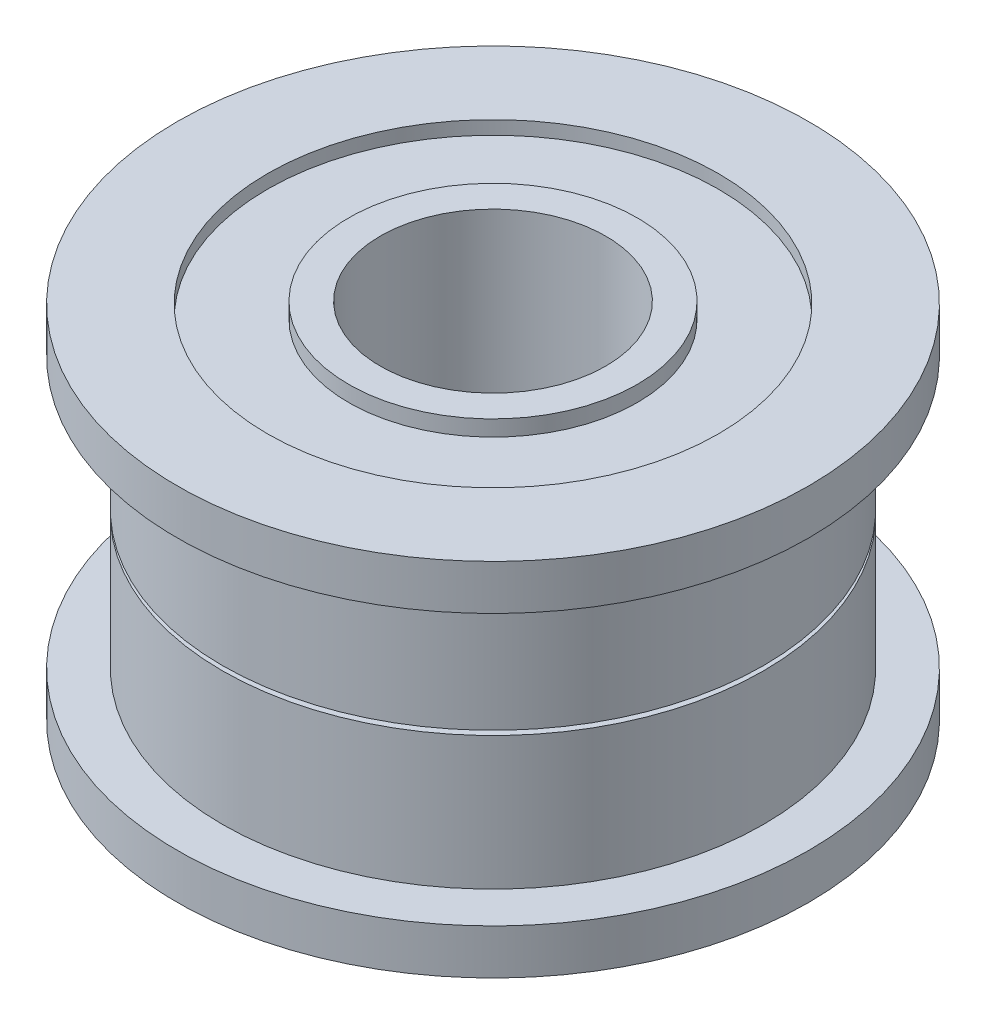
ISO-10303-21;
HEADER;
FILE_DESCRIPTION(('STEP AP214'),'2;1');
FILE_NAME('part.step','',(''),(''),'','','');
FILE_SCHEMA(('AUTOMOTIVE_DESIGN { 1 0 10303 214 1 1 1 1 }'));
ENDSEC;
DATA;
#1=APPLICATION_CONTEXT('core data for automotive mechanical design processes');
#2=APPLICATION_PROTOCOL_DEFINITION('international standard','automotive_design',2000,#1);
#3=PRODUCT_CONTEXT('',#1,'mechanical');
#4=PRODUCT('Part','Part','',(#3));
#5=PRODUCT_RELATED_PRODUCT_CATEGORY('part','',(#4));
#6=PRODUCT_DEFINITION_FORMATION('','',#4);
#7=PRODUCT_DEFINITION_CONTEXT('part definition',#1,'design');
#8=PRODUCT_DEFINITION('design','',#6,#7);
#9=PRODUCT_DEFINITION_SHAPE('','',#8);
#10=(LENGTH_UNIT() NAMED_UNIT(*) SI_UNIT(.MILLI.,.METRE.));
#11=(NAMED_UNIT(*) PLANE_ANGLE_UNIT() SI_UNIT($,.RADIAN.));
#12=(NAMED_UNIT(*) SI_UNIT($,.STERADIAN.) SOLID_ANGLE_UNIT());
#13=UNCERTAINTY_MEASURE_WITH_UNIT(LENGTH_MEASURE(1.E-05),#10,'distance_accuracy_value','');
#14=(GEOMETRIC_REPRESENTATION_CONTEXT(3) GLOBAL_UNCERTAINTY_ASSIGNED_CONTEXT((#13)) GLOBAL_UNIT_ASSIGNED_CONTEXT((#10,
#11,#12)) REPRESENTATION_CONTEXT('',''));
#15=CARTESIAN_POINT('',(0.,0.,0.));
#16=DIRECTION('',(0.,0.,1.));
#17=DIRECTION('',(1.,0.,0.));
#18=AXIS2_PLACEMENT_3D('',#15,#16,#17);
#19=CARTESIAN_POINT('',(0.,3.94999999999998,0.));
#20=DIRECTION('',(0.,1.,0.));
#21=DIRECTION('',(-1.,0.,0.));
#22=AXIS2_PLACEMENT_3D('',#19,#20,#21);
#23=PLANE('',#22);
#24=CARTESIAN_POINT('',(0.,3.9499999999999,0.));
#25=DIRECTION('',(0.,-1.,0.));
#26=DIRECTION('',(1.,0.,0.));
#27=AXIS2_PLACEMENT_3D('',#24,#25,#26);
#28=CIRCLE('',#27,5.00000000000001);
#29=CARTESIAN_POINT('',(5.,3.94999999999992,0.));
#30=VERTEX_POINT('',#29);
#31=EDGE_CURVE('E10',#30,#30,#28,.T.);
#32=ORIENTED_EDGE('',*,*,#31,.T.);
#33=EDGE_LOOP('',(#32));
#34=FACE_BOUND('',#33,.T.);
#35=CARTESIAN_POINT('',(0.,3.9499999999999,0.));
#36=DIRECTION('',(0.,-1.,0.));
#37=DIRECTION('',(1.,0.,0.));
#38=AXIS2_PLACEMENT_3D('',#35,#36,#37);
#39=CIRCLE('',#38,6.00000000000001);
#40=CARTESIAN_POINT('',(6.,3.94999999999992,0.));
#41=VERTEX_POINT('',#40);
#42=EDGE_CURVE('E74',#41,#41,#39,.T.);
#43=ORIENTED_EDGE('',*,*,#42,.F.);
#44=EDGE_LOOP('',(#43));
#45=FACE_BOUND('',#44,.T.);
#46=ADVANCED_FACE('F34',(#34,#45),#23,.T.);
#47=CARTESIAN_POINT('',(3.49148133884313E-12,-1000.,0.));
#48=DIRECTION('',(0.,-1.,0.));
#49=DIRECTION('',(1.,0.,0.));
#50=AXIS2_PLACEMENT_3D('',#47,#48,#49);
#51=CYLINDRICAL_SURFACE('',#50,5.00000000000001);
#52=CARTESIAN_POINT('',(0.,3.70000000000004,0.));
#53=DIRECTION('',(0.,-1.,0.));
#54=DIRECTION('',(1.,0.,0.));
#55=AXIS2_PLACEMENT_3D('',#52,#53,#54);
#56=CIRCLE('',#55,5.00000000000001);
#57=CARTESIAN_POINT('',(5.,3.70000000000005,0.));
#58=VERTEX_POINT('',#57);
#59=EDGE_CURVE('E40',#58,#58,#56,.T.);
#60=ORIENTED_EDGE('',*,*,#59,.T.);
#61=EDGE_LOOP('',(#60));
#62=FACE_BOUND('',#61,.T.);
#63=ORIENTED_EDGE('',*,*,#31,.F.);
#64=EDGE_LOOP('',(#63));
#65=FACE_BOUND('',#64,.T.);
#66=ADVANCED_FACE('F182',(#62,#65),#51,.F.);
#67=CARTESIAN_POINT('',(0.,3.69999999999999,0.));
#68=DIRECTION('',(0.,-1.,0.));
#69=DIRECTION('',(1.,0.,0.));
#70=AXIS2_PLACEMENT_3D('',#67,#68,#69);
#71=PLANE('',#70);
#72=ORIENTED_EDGE('',*,*,#59,.F.);
#73=EDGE_LOOP('',(#72));
#74=FACE_BOUND('',#73,.T.);
#75=CARTESIAN_POINT('',(0.,3.70000000000004,0.));
#76=DIRECTION('',(0.,-1.,0.));
#77=DIRECTION('',(1.,0.,0.));
#78=AXIS2_PLACEMENT_3D('',#75,#76,#77);
#79=CIRCLE('',#78,3.20000000000001);
#80=CARTESIAN_POINT('',(3.2,3.70000000000005,0.));
#81=VERTEX_POINT('',#80);
#82=EDGE_CURVE('E44',#81,#81,#79,.T.);
#83=ORIENTED_EDGE('',*,*,#82,.T.);
#84=EDGE_LOOP('',(#83));
#85=FACE_BOUND('',#84,.T.);
#86=ADVANCED_FACE('F178',(#74,#85),#71,.F.);
#87=CARTESIAN_POINT('',(3.49148133884313E-12,-1000.,0.));
#88=DIRECTION('',(0.,-1.,0.));
#89=DIRECTION('',(1.,0.,0.));
#90=AXIS2_PLACEMENT_3D('',#87,#88,#89);
#91=CYLINDRICAL_SURFACE('',#90,3.20000000000001);
#92=CARTESIAN_POINT('',(0.,4.29999999999993,0.));
#93=DIRECTION('',(0.,-1.,0.));
#94=DIRECTION('',(1.,0.,0.));
#95=AXIS2_PLACEMENT_3D('',#92,#93,#94);
#96=CIRCLE('',#95,3.20000000000001);
#97=CARTESIAN_POINT('',(3.2,4.29999999999994,0.));
#98=VERTEX_POINT('',#97);
#99=EDGE_CURVE('E83',#98,#98,#96,.T.);
#100=ORIENTED_EDGE('',*,*,#99,.T.);
#101=EDGE_LOOP('',(#100));
#102=FACE_BOUND('',#101,.T.);
#103=ORIENTED_EDGE('',*,*,#82,.F.);
#104=EDGE_LOOP('',(#103));
#105=FACE_BOUND('',#104,.T.);
#106=ADVANCED_FACE('F168',(#102,#105),#91,.T.);
#107=CARTESIAN_POINT('',(3.49148133884313E-12,-1000.,0.));
#108=DIRECTION('',(0.,-1.,0.));
#109=DIRECTION('',(1.,0.,0.));
#110=AXIS2_PLACEMENT_3D('',#107,#108,#109);
#111=CYLINDRICAL_SURFACE('',#110,2.50000000000001);
#112=CARTESIAN_POINT('',(0.,-0.0499999999999945,0.));
#113=DIRECTION('',(0.,-1.,0.));
#114=DIRECTION('',(1.,0.,0.));
#115=AXIS2_PLACEMENT_3D('',#112,#113,#114);
#116=CIRCLE('',#115,2.5);
#117=CARTESIAN_POINT('',(2.5,-0.0499999999999858,0.));
#118=VERTEX_POINT('',#117);
#119=EDGE_CURVE('E48',#118,#118,#116,.T.);
#120=ORIENTED_EDGE('',*,*,#119,.T.);
#121=EDGE_LOOP('',(#120));
#122=FACE_BOUND('',#121,.T.);
#123=CARTESIAN_POINT('',(0.,8.04999999999996,0.));
#124=DIRECTION('',(0.,-1.,0.));
#125=DIRECTION('',(1.,0.,0.));
#126=AXIS2_PLACEMENT_3D('',#123,#124,#125);
#127=CIRCLE('',#126,2.5);
#128=CARTESIAN_POINT('',(2.49999999999997,8.04999999999997,0.));
#129=VERTEX_POINT('',#128);
#130=EDGE_CURVE('E86',#129,#129,#127,.T.);
#131=ORIENTED_EDGE('',*,*,#130,.F.);
#132=EDGE_LOOP('',(#131));
#133=FACE_BOUND('',#132,.T.);
#134=ADVANCED_FACE('F165',(#122,#133),#111,.F.);
#135=CARTESIAN_POINT('',(0.,-0.05000000000001,0.));
#136=DIRECTION('',(0.,-1.,0.));
#137=DIRECTION('',(1.,0.,0.));
#138=AXIS2_PLACEMENT_3D('',#135,#136,#137);
#139=PLANE('',#138);
#140=CARTESIAN_POINT('',(0.,-0.0499999999999945,0.));
#141=DIRECTION('',(0.,-1.,0.));
#142=DIRECTION('',(1.,0.,0.));
#143=AXIS2_PLACEMENT_3D('',#140,#141,#142);
#144=CIRCLE('',#143,3.2);
#145=CARTESIAN_POINT('',(3.2,-0.0499999999999833,0.));
#146=VERTEX_POINT('',#145);
#147=EDGE_CURVE('E53',#146,#146,#144,.T.);
#148=ORIENTED_EDGE('',*,*,#147,.T.);
#149=EDGE_LOOP('',(#148));
#150=FACE_BOUND('',#149,.T.);
#151=ORIENTED_EDGE('',*,*,#119,.F.);
#152=EDGE_LOOP('',(#151));
#153=FACE_BOUND('',#152,.T.);
#154=ADVANCED_FACE('F167',(#150,#153),#139,.T.);
#155=CARTESIAN_POINT('',(3.49148133884313E-12,-1000.,0.));
#156=DIRECTION('',(0.,-1.,0.));
#157=DIRECTION('',(1.,0.,0.));
#158=AXIS2_PLACEMENT_3D('',#155,#156,#157);
#159=CYLINDRICAL_SURFACE('',#158,3.2);
#160=CARTESIAN_POINT('',(0.,0.299999999999967,0.));
#161=DIRECTION('',(0.,-1.,0.));
#162=DIRECTION('',(1.,0.,0.));
#163=AXIS2_PLACEMENT_3D('',#160,#161,#162);
#164=CIRCLE('',#163,3.2);
#165=CARTESIAN_POINT('',(3.2,0.299999999999978,0.));
#166=VERTEX_POINT('',#165);
#167=EDGE_CURVE('E56',#166,#166,#164,.T.);
#168=ORIENTED_EDGE('',*,*,#167,.T.);
#169=EDGE_LOOP('',(#168));
#170=FACE_BOUND('',#169,.T.);
#171=ORIENTED_EDGE('',*,*,#147,.F.);
#172=EDGE_LOOP('',(#171));
#173=FACE_BOUND('',#172,.T.);
#174=ADVANCED_FACE('F175',(#170,#173),#159,.T.);
#175=CARTESIAN_POINT('',(0.,0.299999999999986,0.));
#176=DIRECTION('',(0.,-1.,0.));
#177=DIRECTION('',(1.,0.,0.));
#178=AXIS2_PLACEMENT_3D('',#175,#176,#177);
#179=PLANE('',#178);
#180=CARTESIAN_POINT('',(0.,0.299999999999967,0.));
#181=DIRECTION('',(0.,-1.,0.));
#182=DIRECTION('',(1.,0.,0.));
#183=AXIS2_PLACEMENT_3D('',#180,#181,#182);
#184=CIRCLE('',#183,5.);
#185=CARTESIAN_POINT('',(5.,0.299999999999984,0.));
#186=VERTEX_POINT('',#185);
#187=EDGE_CURVE('E59',#186,#186,#184,.T.);
#188=ORIENTED_EDGE('',*,*,#187,.T.);
#189=EDGE_LOOP('',(#188));
#190=FACE_BOUND('',#189,.T.);
#191=ORIENTED_EDGE('',*,*,#167,.F.);
#192=EDGE_LOOP('',(#191));
#193=FACE_BOUND('',#192,.T.);
#194=ADVANCED_FACE('F216',(#190,#193),#179,.T.);
#195=CARTESIAN_POINT('',(3.49148133884313E-12,-1000.,0.));
#196=DIRECTION('',(0.,-1.,0.));
#197=DIRECTION('',(1.,0.,0.));
#198=AXIS2_PLACEMENT_3D('',#195,#196,#197);
#199=CYLINDRICAL_SURFACE('',#198,5.);
#200=CARTESIAN_POINT('',(0.,0.,0.));
#201=DIRECTION('',(0.,-1.,0.));
#202=DIRECTION('',(1.,0.,0.));
#203=AXIS2_PLACEMENT_3D('',#200,#201,#202);
#204=CIRCLE('',#203,5.);
#205=CARTESIAN_POINT('',(5.,0.,0.));
#206=VERTEX_POINT('',#205);
#207=EDGE_CURVE('E62',#206,#206,#204,.T.);
#208=ORIENTED_EDGE('',*,*,#207,.T.);
#209=EDGE_LOOP('',(#208));
#210=FACE_BOUND('',#209,.T.);
#211=ORIENTED_EDGE('',*,*,#187,.F.);
#212=EDGE_LOOP('',(#211));
#213=FACE_BOUND('',#212,.T.);
#214=ADVANCED_FACE('F210',(#210,#213),#199,.F.);
#215=CARTESIAN_POINT('',(0.,0.,0.));
#216=DIRECTION('',(0.,-1.,0.));
#217=DIRECTION('',(1.,0.,0.));
#218=AXIS2_PLACEMENT_3D('',#215,#216,#217);
#219=PLANE('',#218);
#220=CARTESIAN_POINT('',(0.,0.,0.));
#221=DIRECTION('',(0.,-1.,0.));
#222=DIRECTION('',(1.,0.,0.));
#223=AXIS2_PLACEMENT_3D('',#220,#221,#222);
#224=CIRCLE('',#223,7.);
#225=CARTESIAN_POINT('',(7.,0.,0.));
#226=VERTEX_POINT('',#225);
#227=EDGE_CURVE('E65',#226,#226,#224,.T.);
#228=ORIENTED_EDGE('',*,*,#227,.T.);
#229=EDGE_LOOP('',(#228));
#230=FACE_BOUND('',#229,.T.);
#231=ORIENTED_EDGE('',*,*,#207,.F.);
#232=EDGE_LOOP('',(#231));
#233=FACE_BOUND('',#232,.T.);
#234=ADVANCED_FACE('F204',(#230,#233),#219,.T.);
#235=CARTESIAN_POINT('',(3.49148133884313E-12,-1000.,0.));
#236=DIRECTION('',(0.,-1.,0.));
#237=DIRECTION('',(1.,0.,0.));
#238=AXIS2_PLACEMENT_3D('',#235,#236,#237);
#239=CYLINDRICAL_SURFACE('',#238,7.);
#240=CARTESIAN_POINT('',(0.,0.99999999999989,0.));
#241=DIRECTION('',(0.,-1.,0.));
#242=DIRECTION('',(1.,0.,0.));
#243=AXIS2_PLACEMENT_3D('',#240,#241,#242);
#244=CIRCLE('',#243,7.);
#245=CARTESIAN_POINT('',(7.,0.999999999999914,0.));
#246=VERTEX_POINT('',#245);
#247=EDGE_CURVE('E68',#246,#246,#244,.T.);
#248=ORIENTED_EDGE('',*,*,#247,.T.);
#249=EDGE_LOOP('',(#248));
#250=FACE_BOUND('',#249,.T.);
#251=ORIENTED_EDGE('',*,*,#227,.F.);
#252=EDGE_LOOP('',(#251));
#253=FACE_BOUND('',#252,.T.);
#254=ADVANCED_FACE('F198',(#250,#253),#239,.T.);
#255=CARTESIAN_POINT('',(0.,0.999999999999977,0.));
#256=DIRECTION('',(0.,1.,0.));
#257=DIRECTION('',(-1.,0.,0.));
#258=AXIS2_PLACEMENT_3D('',#255,#256,#257);
#259=PLANE('',#258);
#260=CARTESIAN_POINT('',(0.,0.99999999999989,0.));
#261=DIRECTION('',(0.,-1.,0.));
#262=DIRECTION('',(1.,0.,0.));
#263=AXIS2_PLACEMENT_3D('',#260,#261,#262);
#264=CIRCLE('',#263,6.);
#265=CARTESIAN_POINT('',(6.,0.999999999999911,0.));
#266=VERTEX_POINT('',#265);
#267=EDGE_CURVE('E71',#266,#266,#264,.T.);
#268=ORIENTED_EDGE('',*,*,#267,.T.);
#269=EDGE_LOOP('',(#268));
#270=FACE_BOUND('',#269,.T.);
#271=ORIENTED_EDGE('',*,*,#247,.F.);
#272=EDGE_LOOP('',(#271));
#273=FACE_BOUND('',#272,.T.);
#274=ADVANCED_FACE('F192',(#270,#273),#259,.T.);
#275=CARTESIAN_POINT('',(3.49148133884313E-12,-1000.,0.));
#276=DIRECTION('',(0.,-1.,0.));
#277=DIRECTION('',(1.,0.,0.));
#278=AXIS2_PLACEMENT_3D('',#275,#276,#277);
#279=CYLINDRICAL_SURFACE('',#278,6.00000000000001);
#280=ORIENTED_EDGE('',*,*,#42,.T.);
#281=EDGE_LOOP('',(#280));
#282=FACE_BOUND('',#281,.T.);
#283=ORIENTED_EDGE('',*,*,#267,.F.);
#284=EDGE_LOOP('',(#283));
#285=FACE_BOUND('',#284,.T.);
#286=ADVANCED_FACE('F189',(#282,#285),#279,.T.);
#287=CARTESIAN_POINT('',(0.,4.04999999999998,0.));
#288=DIRECTION('',(0.,-1.,0.));
#289=DIRECTION('',(-1.,0.,0.));
#290=AXIS2_PLACEMENT_3D('',#287,#288,#289);
#291=PLANE('',#290);
#292=CARTESIAN_POINT('',(0.,4.05000000000006,0.));
#293=DIRECTION('',(0.,-1.,0.));
#294=DIRECTION('',(1.,0.,0.));
#295=AXIS2_PLACEMENT_3D('',#292,#293,#294);
#296=CIRCLE('',#295,5.00000000000001);
#297=CARTESIAN_POINT('',(5.,4.05000000000008,0.));
#298=VERTEX_POINT('',#297);
#299=EDGE_CURVE('E77',#298,#298,#296,.T.);
#300=ORIENTED_EDGE('',*,*,#299,.F.);
#301=EDGE_LOOP('',(#300));
#302=FACE_BOUND('',#301,.T.);
#303=CARTESIAN_POINT('',(0.,4.05000000000006,0.));
#304=DIRECTION('',(0.,-1.,0.));
#305=DIRECTION('',(1.,0.,0.));
#306=AXIS2_PLACEMENT_3D('',#303,#304,#305);
#307=CIRCLE('',#306,6.00000000000001);
#308=CARTESIAN_POINT('',(6.,4.05000000000009,0.));
#309=VERTEX_POINT('',#308);
#310=EDGE_CURVE('E110',#309,#309,#307,.T.);
#311=ORIENTED_EDGE('',*,*,#310,.T.);
#312=EDGE_LOOP('',(#311));
#313=FACE_BOUND('',#312,.T.);
#314=ADVANCED_FACE('F114',(#302,#313),#291,.T.);
#315=CARTESIAN_POINT('',(-3.51941318955388E-12,1008.,0.));
#316=DIRECTION('',(0.,1.,0.));
#317=DIRECTION('',(1.,0.,0.));
#318=AXIS2_PLACEMENT_3D('',#315,#316,#317);
#319=CYLINDRICAL_SURFACE('',#318,5.00000000000001);
#320=CARTESIAN_POINT('',(0.,4.29999999999993,0.));
#321=DIRECTION('',(0.,-1.,0.));
#322=DIRECTION('',(1.,0.,0.));
#323=AXIS2_PLACEMENT_3D('',#320,#321,#322);
#324=CIRCLE('',#323,5.00000000000001);
#325=CARTESIAN_POINT('',(5.,4.29999999999994,0.));
#326=VERTEX_POINT('',#325);
#327=EDGE_CURVE('E80',#326,#326,#324,.T.);
#328=ORIENTED_EDGE('',*,*,#327,.F.);
#329=EDGE_LOOP('',(#328));
#330=FACE_BOUND('',#329,.T.);
#331=ORIENTED_EDGE('',*,*,#299,.T.);
#332=EDGE_LOOP('',(#331));
#333=FACE_BOUND('',#332,.T.);
#334=ADVANCED_FACE('F236',(#330,#333),#319,.F.);
#335=CARTESIAN_POINT('',(0.,4.29999999999998,0.));
#336=DIRECTION('',(0.,1.,0.));
#337=DIRECTION('',(1.,0.,0.));
#338=AXIS2_PLACEMENT_3D('',#335,#336,#337);
#339=PLANE('',#338);
#340=ORIENTED_EDGE('',*,*,#327,.T.);
#341=EDGE_LOOP('',(#340));
#342=FACE_BOUND('',#341,.T.);
#343=ORIENTED_EDGE('',*,*,#99,.F.);
#344=EDGE_LOOP('',(#343));
#345=FACE_BOUND('',#344,.T.);
#346=ADVANCED_FACE('F161',(#342,#345),#339,.F.);
#347=CARTESIAN_POINT('',(0.,8.04999999999997,0.));
#348=DIRECTION('',(0.,1.,0.));
#349=DIRECTION('',(1.,0.,0.));
#350=AXIS2_PLACEMENT_3D('',#347,#348,#349);
#351=PLANE('',#350);
#352=CARTESIAN_POINT('',(0.,8.04999999999996,0.));
#353=DIRECTION('',(0.,-1.,0.));
#354=DIRECTION('',(1.,0.,0.));
#355=AXIS2_PLACEMENT_3D('',#352,#353,#354);
#356=CIRCLE('',#355,3.2);
#357=CARTESIAN_POINT('',(3.19999999999997,8.04999999999997,0.));
#358=VERTEX_POINT('',#357);
#359=EDGE_CURVE('E89',#358,#358,#356,.T.);
#360=ORIENTED_EDGE('',*,*,#359,.F.);
#361=EDGE_LOOP('',(#360));
#362=FACE_BOUND('',#361,.T.);
#363=ORIENTED_EDGE('',*,*,#130,.T.);
#364=EDGE_LOOP('',(#363));
#365=FACE_BOUND('',#364,.T.);
#366=ADVANCED_FACE('F155',(#362,#365),#351,.T.);
#367=CARTESIAN_POINT('',(-3.51941318955388E-12,1008.,0.));
#368=DIRECTION('',(0.,1.,0.));
#369=DIRECTION('',(1.,0.,0.));
#370=AXIS2_PLACEMENT_3D('',#367,#368,#369);
#371=CYLINDRICAL_SURFACE('',#370,3.2);
#372=CARTESIAN_POINT('',(0.,7.69999999999999,0.));
#373=DIRECTION('',(0.,-1.,0.));
#374=DIRECTION('',(1.,0.,0.));
#375=AXIS2_PLACEMENT_3D('',#372,#373,#374);
#376=CIRCLE('',#375,3.2);
#377=CARTESIAN_POINT('',(3.19999999999997,7.70000000000001,0.));
#378=VERTEX_POINT('',#377);
#379=EDGE_CURVE('E92',#378,#378,#376,.T.);
#380=ORIENTED_EDGE('',*,*,#379,.F.);
#381=EDGE_LOOP('',(#380));
#382=FACE_BOUND('',#381,.T.);
#383=ORIENTED_EDGE('',*,*,#359,.T.);
#384=EDGE_LOOP('',(#383));
#385=FACE_BOUND('',#384,.T.);
#386=ADVANCED_FACE('F149',(#382,#385),#371,.T.);
#387=CARTESIAN_POINT('',(0.,7.69999999999998,0.));
#388=DIRECTION('',(0.,1.,0.));
#389=DIRECTION('',(1.,0.,0.));
#390=AXIS2_PLACEMENT_3D('',#387,#388,#389);
#391=PLANE('',#390);
#392=CARTESIAN_POINT('',(0.,7.69999999999999,0.));
#393=DIRECTION('',(0.,-1.,0.));
#394=DIRECTION('',(1.,0.,0.));
#395=AXIS2_PLACEMENT_3D('',#392,#393,#394);
#396=CIRCLE('',#395,5.);
#397=CARTESIAN_POINT('',(4.99999999999998,7.70000000000001,0.));
#398=VERTEX_POINT('',#397);
#399=EDGE_CURVE('E95',#398,#398,#396,.T.);
#400=ORIENTED_EDGE('',*,*,#399,.F.);
#401=EDGE_LOOP('',(#400));
#402=FACE_BOUND('',#401,.T.);
#403=ORIENTED_EDGE('',*,*,#379,.T.);
#404=EDGE_LOOP('',(#403));
#405=FACE_BOUND('',#404,.T.);
#406=ADVANCED_FACE('F143',(#402,#405),#391,.T.);
#407=CARTESIAN_POINT('',(-3.51941318955388E-12,1008.,0.));
#408=DIRECTION('',(0.,1.,0.));
#409=DIRECTION('',(1.,0.,0.));
#410=AXIS2_PLACEMENT_3D('',#407,#408,#409);
#411=CYLINDRICAL_SURFACE('',#410,5.);
#412=CARTESIAN_POINT('',(0.,7.99999999999996,0.));
#413=DIRECTION('',(0.,-1.,0.));
#414=DIRECTION('',(1.,0.,0.));
#415=AXIS2_PLACEMENT_3D('',#412,#413,#414);
#416=CIRCLE('',#415,5.);
#417=CARTESIAN_POINT('',(4.99999999999997,7.99999999999998,0.));
#418=VERTEX_POINT('',#417);
#419=EDGE_CURVE('E98',#418,#418,#416,.T.);
#420=ORIENTED_EDGE('',*,*,#419,.F.);
#421=EDGE_LOOP('',(#420));
#422=FACE_BOUND('',#421,.T.);
#423=ORIENTED_EDGE('',*,*,#399,.T.);
#424=EDGE_LOOP('',(#423));
#425=FACE_BOUND('',#424,.T.);
#426=ADVANCED_FACE('F137',(#422,#425),#411,.F.);
#427=CARTESIAN_POINT('',(0.,7.99999999999998,0.));
#428=DIRECTION('',(0.,1.,0.));
#429=DIRECTION('',(1.,0.,0.));
#430=AXIS2_PLACEMENT_3D('',#427,#428,#429);
#431=PLANE('',#430);
#432=CARTESIAN_POINT('',(0.,7.99999999999996,0.));
#433=DIRECTION('',(0.,-1.,0.));
#434=DIRECTION('',(1.,0.,0.));
#435=AXIS2_PLACEMENT_3D('',#432,#433,#434);
#436=CIRCLE('',#435,7.);
#437=CARTESIAN_POINT('',(6.99999999999997,7.99999999999999,0.));
#438=VERTEX_POINT('',#437);
#439=EDGE_CURVE('E101',#438,#438,#436,.T.);
#440=ORIENTED_EDGE('',*,*,#439,.F.);
#441=EDGE_LOOP('',(#440));
#442=FACE_BOUND('',#441,.T.);
#443=ORIENTED_EDGE('',*,*,#419,.T.);
#444=EDGE_LOOP('',(#443));
#445=FACE_BOUND('',#444,.T.);
#446=ADVANCED_FACE('F131',(#442,#445),#431,.T.);
#447=CARTESIAN_POINT('',(-3.51941318955388E-12,1008.,0.));
#448=DIRECTION('',(0.,1.,0.));
#449=DIRECTION('',(1.,0.,0.));
#450=AXIS2_PLACEMENT_3D('',#447,#448,#449);
#451=CYLINDRICAL_SURFACE('',#450,7.);
#452=CARTESIAN_POINT('',(0.,7.00000000000007,0.));
#453=DIRECTION('',(0.,-1.,0.));
#454=DIRECTION('',(1.,0.,0.));
#455=AXIS2_PLACEMENT_3D('',#452,#453,#454);
#456=CIRCLE('',#455,7.);
#457=CARTESIAN_POINT('',(6.99999999999998,7.0000000000001,0.));
#458=VERTEX_POINT('',#457);
#459=EDGE_CURVE('E104',#458,#458,#456,.T.);
#460=ORIENTED_EDGE('',*,*,#459,.F.);
#461=EDGE_LOOP('',(#460));
#462=FACE_BOUND('',#461,.T.);
#463=ORIENTED_EDGE('',*,*,#439,.T.);
#464=EDGE_LOOP('',(#463));
#465=FACE_BOUND('',#464,.T.);
#466=ADVANCED_FACE('F125',(#462,#465),#451,.T.);
#467=CARTESIAN_POINT('',(0.,6.99999999999998,0.));
#468=DIRECTION('',(0.,-1.,0.));
#469=DIRECTION('',(-1.,0.,0.));
#470=AXIS2_PLACEMENT_3D('',#467,#468,#469);
#471=PLANE('',#470);
#472=CARTESIAN_POINT('',(0.,7.00000000000007,0.));
#473=DIRECTION('',(0.,-1.,0.));
#474=DIRECTION('',(1.,0.,0.));
#475=AXIS2_PLACEMENT_3D('',#472,#473,#474);
#476=CIRCLE('',#475,6.);
#477=CARTESIAN_POINT('',(5.99999999999998,7.00000000000009,0.));
#478=VERTEX_POINT('',#477);
#479=EDGE_CURVE('E107',#478,#478,#476,.T.);
#480=ORIENTED_EDGE('',*,*,#479,.F.);
#481=EDGE_LOOP('',(#480));
#482=FACE_BOUND('',#481,.T.);
#483=ORIENTED_EDGE('',*,*,#459,.T.);
#484=EDGE_LOOP('',(#483));
#485=FACE_BOUND('',#484,.T.);
#486=ADVANCED_FACE('F119',(#482,#485),#471,.T.);
#487=CARTESIAN_POINT('',(-3.51941318955388E-12,1008.,0.));
#488=DIRECTION('',(0.,1.,0.));
#489=DIRECTION('',(1.,0.,0.));
#490=AXIS2_PLACEMENT_3D('',#487,#488,#489);
#491=CYLINDRICAL_SURFACE('',#490,6.00000000000001);
#492=ORIENTED_EDGE('',*,*,#310,.F.);
#493=EDGE_LOOP('',(#492));
#494=FACE_BOUND('',#493,.T.);
#495=ORIENTED_EDGE('',*,*,#479,.T.);
#496=EDGE_LOOP('',(#495));
#497=FACE_BOUND('',#496,.T.);
#498=ADVANCED_FACE('F116',(#494,#497),#491,.T.);
#499=CLOSED_SHELL('',(#46,#66,#86,#106,#134,#154,#174,#194,#214,#234,#254,#274,#286,#314,#334,
#346,#366,#386,#406,#426,#446,#466,#486,#498));
#500=MANIFOLD_SOLID_BREP('B2',#499);
#501=ADVANCED_BREP_SHAPE_REPRESENTATION('',(#18,#500),#14);
#502=SHAPE_DEFINITION_REPRESENTATION(#9,#501);
ENDSEC;
END-ISO-10303-21;
